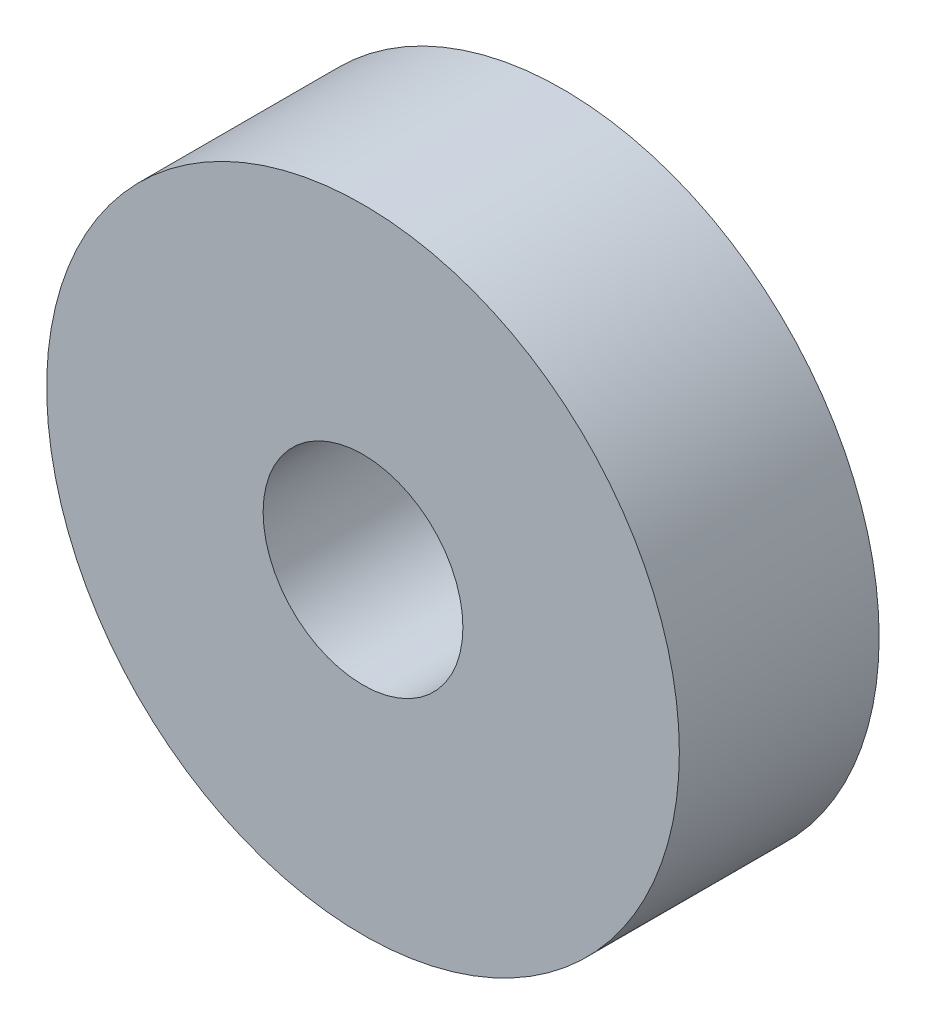
ISO-10303-21;
HEADER;
FILE_DESCRIPTION(('STEP AP214'),'2;1');
FILE_NAME('part.step','',(''),(''),'','','');
FILE_SCHEMA(('AUTOMOTIVE_DESIGN { 1 0 10303 214 1 1 1 1 }'));
ENDSEC;
DATA;
#1=APPLICATION_CONTEXT('core data for automotive mechanical design processes');
#2=APPLICATION_PROTOCOL_DEFINITION('international standard','automotive_design',2000,#1);
#3=PRODUCT_CONTEXT('',#1,'mechanical');
#4=PRODUCT('Part','Part','',(#3));
#5=PRODUCT_RELATED_PRODUCT_CATEGORY('part','',(#4));
#6=PRODUCT_DEFINITION_FORMATION('','',#4);
#7=PRODUCT_DEFINITION_CONTEXT('part definition',#1,'design');
#8=PRODUCT_DEFINITION('design','',#6,#7);
#9=PRODUCT_DEFINITION_SHAPE('','',#8);
#10=(LENGTH_UNIT() NAMED_UNIT(*) SI_UNIT(.MILLI.,.METRE.));
#11=(NAMED_UNIT(*) PLANE_ANGLE_UNIT() SI_UNIT($,.RADIAN.));
#12=(NAMED_UNIT(*) SI_UNIT($,.STERADIAN.) SOLID_ANGLE_UNIT());
#13=UNCERTAINTY_MEASURE_WITH_UNIT(LENGTH_MEASURE(1.E-05),#10,'distance_accuracy_value','');
#14=(GEOMETRIC_REPRESENTATION_CONTEXT(3) GLOBAL_UNCERTAINTY_ASSIGNED_CONTEXT((#13)) GLOBAL_UNIT_ASSIGNED_CONTEXT((#10,
#11,#12)) REPRESENTATION_CONTEXT('',''));
#15=CARTESIAN_POINT('',(0.,0.,0.));
#16=DIRECTION('',(0.,0.,1.));
#17=DIRECTION('',(1.,0.,0.));
#18=AXIS2_PLACEMENT_3D('',#15,#16,#17);
#19=CARTESIAN_POINT('',(0.,0.,6.));
#20=DIRECTION('',(0.,0.,1.));
#21=DIRECTION('',(1.,0.,0.));
#22=AXIS2_PLACEMENT_3D('',#19,#20,#21);
#23=PLANE('',#22);
#24=CARTESIAN_POINT('',(0.,0.,6.));
#25=DIRECTION('',(0.,0.,1.));
#26=DIRECTION('',(1.,0.,0.));
#27=AXIS2_PLACEMENT_3D('',#24,#25,#26);
#28=CIRCLE('',#27,9.5);
#29=CARTESIAN_POINT('',(9.5,0.,6.));
#30=VERTEX_POINT('',#29);
#31=EDGE_CURVE('E10',#30,#30,#28,.T.);
#32=ORIENTED_EDGE('',*,*,#31,.T.);
#33=EDGE_LOOP('',(#32));
#34=FACE_BOUND('',#33,.T.);
#35=CARTESIAN_POINT('',(0.,0.,6.));
#36=DIRECTION('',(0.,0.,1.));
#37=DIRECTION('',(1.,0.,0.));
#38=AXIS2_PLACEMENT_3D('',#35,#36,#37);
#39=CIRCLE('',#38,3.);
#40=CARTESIAN_POINT('',(3.,0.,6.));
#41=VERTEX_POINT('',#40);
#42=EDGE_CURVE('E42',#41,#41,#39,.T.);
#43=ORIENTED_EDGE('',*,*,#42,.F.);
#44=EDGE_LOOP('',(#43));
#45=FACE_BOUND('',#44,.T.);
#46=ADVANCED_FACE('F31',(#34,#45),#23,.T.);
#47=CARTESIAN_POINT('',(0.,0.,0.));
#48=DIRECTION('',(0.,0.,1.));
#49=DIRECTION('',(1.,0.,0.));
#50=AXIS2_PLACEMENT_3D('',#47,#48,#49);
#51=PLANE('',#50);
#52=CARTESIAN_POINT('',(0.,0.,0.));
#53=DIRECTION('',(0.,0.,1.));
#54=DIRECTION('',(1.,0.,0.));
#55=AXIS2_PLACEMENT_3D('',#52,#53,#54);
#56=CIRCLE('',#55,9.5);
#57=CARTESIAN_POINT('',(9.5,0.,0.));
#58=VERTEX_POINT('',#57);
#59=EDGE_CURVE('E35',#58,#58,#56,.T.);
#60=ORIENTED_EDGE('',*,*,#59,.F.);
#61=EDGE_LOOP('',(#60));
#62=FACE_BOUND('',#61,.T.);
#63=CARTESIAN_POINT('',(0.,0.,0.));
#64=DIRECTION('',(0.,0.,1.));
#65=DIRECTION('',(1.,0.,0.));
#66=AXIS2_PLACEMENT_3D('',#63,#64,#65);
#67=CIRCLE('',#66,3.);
#68=CARTESIAN_POINT('',(3.,0.,0.));
#69=VERTEX_POINT('',#68);
#70=EDGE_CURVE('E44',#69,#69,#67,.T.);
#71=ORIENTED_EDGE('',*,*,#70,.T.);
#72=EDGE_LOOP('',(#71));
#73=FACE_BOUND('',#72,.T.);
#74=ADVANCED_FACE('F54',(#62,#73),#51,.F.);
#75=CARTESIAN_POINT('',(0.,0.,6.));
#76=DIRECTION('',(0.,0.,-1.));
#77=DIRECTION('',(-1.,0.,0.));
#78=AXIS2_PLACEMENT_3D('',#75,#76,#77);
#79=CYLINDRICAL_SURFACE('',#78,9.5);
#80=ORIENTED_EDGE('',*,*,#31,.F.);
#81=EDGE_LOOP('',(#80));
#82=FACE_BOUND('',#81,.T.);
#83=ORIENTED_EDGE('',*,*,#59,.T.);
#84=EDGE_LOOP('',(#83));
#85=FACE_BOUND('',#84,.T.);
#86=ADVANCED_FACE('F33',(#82,#85),#79,.T.);
#87=CARTESIAN_POINT('',(0.,0.,6.));
#88=DIRECTION('',(0.,0.,-1.));
#89=DIRECTION('',(-1.,0.,0.));
#90=AXIS2_PLACEMENT_3D('',#87,#88,#89);
#91=CYLINDRICAL_SURFACE('',#90,3.);
#92=ORIENTED_EDGE('',*,*,#42,.T.);
#93=EDGE_LOOP('',(#92));
#94=FACE_BOUND('',#93,.T.);
#95=ORIENTED_EDGE('',*,*,#70,.F.);
#96=EDGE_LOOP('',(#95));
#97=FACE_BOUND('',#96,.T.);
#98=ADVANCED_FACE('F50',(#94,#97),#91,.F.);
#99=CLOSED_SHELL('',(#46,#74,#86,#98));
#100=MANIFOLD_SOLID_BREP('B2',#99);
#101=ADVANCED_BREP_SHAPE_REPRESENTATION('',(#18,#100),#14);
#102=SHAPE_DEFINITION_REPRESENTATION(#9,#101);
ENDSEC;
END-ISO-10303-21;
